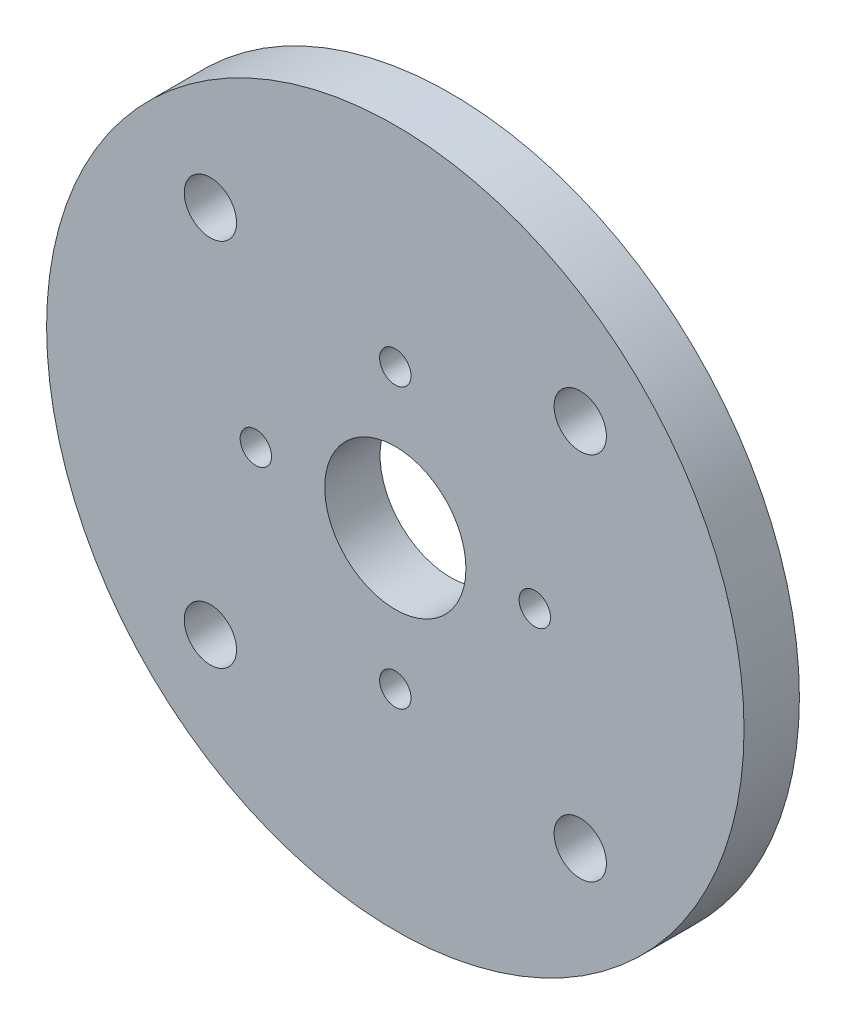
ISO-10303-21;
HEADER;
FILE_DESCRIPTION(('STEP AP214'),'2;1');
FILE_NAME('part.step','',(''),(''),'','','');
FILE_SCHEMA(('AUTOMOTIVE_DESIGN { 1 0 10303 214 1 1 1 1 }'));
ENDSEC;
DATA;
#1=APPLICATION_CONTEXT('core data for automotive mechanical design processes');
#2=APPLICATION_PROTOCOL_DEFINITION('international standard','automotive_design',2000,#1);
#3=PRODUCT_CONTEXT('',#1,'mechanical');
#4=PRODUCT('Part','Part','',(#3));
#5=PRODUCT_RELATED_PRODUCT_CATEGORY('part','',(#4));
#6=PRODUCT_DEFINITION_FORMATION('','',#4);
#7=PRODUCT_DEFINITION_CONTEXT('part definition',#1,'design');
#8=PRODUCT_DEFINITION('design','',#6,#7);
#9=PRODUCT_DEFINITION_SHAPE('','',#8);
#10=(LENGTH_UNIT() NAMED_UNIT(*) SI_UNIT(.MILLI.,.METRE.));
#11=(NAMED_UNIT(*) PLANE_ANGLE_UNIT() SI_UNIT($,.RADIAN.));
#12=(NAMED_UNIT(*) SI_UNIT($,.STERADIAN.) SOLID_ANGLE_UNIT());
#13=UNCERTAINTY_MEASURE_WITH_UNIT(LENGTH_MEASURE(1.E-05),#10,'distance_accuracy_value','');
#14=(GEOMETRIC_REPRESENTATION_CONTEXT(3) GLOBAL_UNCERTAINTY_ASSIGNED_CONTEXT((#13)) GLOBAL_UNIT_ASSIGNED_CONTEXT((#10,
#11,#12)) REPRESENTATION_CONTEXT('',''));
#15=CARTESIAN_POINT('',(0.,0.,0.));
#16=DIRECTION('',(0.,0.,1.));
#17=DIRECTION('',(1.,0.,0.));
#18=AXIS2_PLACEMENT_3D('',#15,#16,#17);
#19=CARTESIAN_POINT('',(0.,0.,3.175));
#20=DIRECTION('',(0.,0.,-1.));
#21=DIRECTION('',(-1.,0.,0.));
#22=AXIS2_PLACEMENT_3D('',#19,#20,#21);
#23=CYLINDRICAL_SURFACE('',#22,20.);
#24=CARTESIAN_POINT('',(0.,0.,3.175));
#25=DIRECTION('',(0.,0.,1.));
#26=DIRECTION('',(1.,0.,0.));
#27=AXIS2_PLACEMENT_3D('',#24,#25,#26);
#28=CIRCLE('',#27,20.);
#29=CARTESIAN_POINT('',(20.,0.,3.175));
#30=VERTEX_POINT('',#29);
#31=EDGE_CURVE('E10',#30,#30,#28,.T.);
#32=ORIENTED_EDGE('',*,*,#31,.F.);
#33=EDGE_LOOP('',(#32));
#34=FACE_BOUND('',#33,.T.);
#35=CARTESIAN_POINT('',(0.,0.,0.));
#36=DIRECTION('',(0.,0.,1.));
#37=DIRECTION('',(1.,0.,0.));
#38=AXIS2_PLACEMENT_3D('',#35,#36,#37);
#39=CIRCLE('',#38,20.);
#40=CARTESIAN_POINT('',(20.,0.,0.));
#41=VERTEX_POINT('',#40);
#42=EDGE_CURVE('E39',#41,#41,#39,.T.);
#43=ORIENTED_EDGE('',*,*,#42,.T.);
#44=EDGE_LOOP('',(#43));
#45=FACE_BOUND('',#44,.T.);
#46=ADVANCED_FACE('F36',(#34,#45),#23,.T.);
#47=CARTESIAN_POINT('',(0.,0.,3.175));
#48=DIRECTION('',(0.,0.,1.));
#49=DIRECTION('',(1.,0.,0.));
#50=AXIS2_PLACEMENT_3D('',#47,#48,#49);
#51=PLANE('',#50);
#52=CARTESIAN_POINT('',(-10.6066017177982,10.6066017177982,3.175));
#53=DIRECTION('',(0.,0.,1.));
#54=DIRECTION('',(1.,0.,0.));
#55=AXIS2_PLACEMENT_3D('',#52,#53,#54);
#56=CIRCLE('',#55,1.5);
#57=CARTESIAN_POINT('',(-9.10660171779824,10.6066017177982,3.175));
#58=VERTEX_POINT('',#57);
#59=EDGE_CURVE('E70',#58,#58,#56,.T.);
#60=ORIENTED_EDGE('',*,*,#59,.F.);
#61=EDGE_LOOP('',(#60));
#62=FACE_BOUND('',#61,.T.);
#63=CARTESIAN_POINT('',(-10.6066017177982,-10.6066017177982,3.175));
#64=DIRECTION('',(0.,0.,1.));
#65=DIRECTION('',(1.,0.,0.));
#66=AXIS2_PLACEMENT_3D('',#63,#64,#65);
#67=CIRCLE('',#66,1.5);
#68=CARTESIAN_POINT('',(-9.10660171779819,-10.6066017177982,3.175));
#69=VERTEX_POINT('',#68);
#70=EDGE_CURVE('E80',#69,#69,#67,.T.);
#71=ORIENTED_EDGE('',*,*,#70,.F.);
#72=EDGE_LOOP('',(#71));
#73=FACE_BOUND('',#72,.T.);
#74=CARTESIAN_POINT('',(10.6066017177982,-10.6066017177982,3.175));
#75=DIRECTION('',(0.,0.,1.));
#76=DIRECTION('',(1.,0.,0.));
#77=AXIS2_PLACEMENT_3D('',#74,#75,#76);
#78=CIRCLE('',#77,1.5);
#79=CARTESIAN_POINT('',(12.1066017177982,-10.6066017177982,3.175));
#80=VERTEX_POINT('',#79);
#81=EDGE_CURVE('E83',#80,#80,#78,.T.);
#82=ORIENTED_EDGE('',*,*,#81,.F.);
#83=EDGE_LOOP('',(#82));
#84=FACE_BOUND('',#83,.T.);
#85=CARTESIAN_POINT('',(10.6066017177982,10.6066017177982,3.175));
#86=DIRECTION('',(0.,0.,1.));
#87=DIRECTION('',(1.,0.,0.));
#88=AXIS2_PLACEMENT_3D('',#85,#86,#87);
#89=CIRCLE('',#88,1.5);
#90=CARTESIAN_POINT('',(12.1066017177982,10.6066017177982,3.175));
#91=VERTEX_POINT('',#90);
#92=EDGE_CURVE('E86',#91,#91,#89,.T.);
#93=ORIENTED_EDGE('',*,*,#92,.F.);
#94=EDGE_LOOP('',(#93));
#95=FACE_BOUND('',#94,.T.);
#96=CARTESIAN_POINT('',(0.,8.,3.175));
#97=DIRECTION('',(0.,0.,1.));
#98=DIRECTION('',(1.,0.,0.));
#99=AXIS2_PLACEMENT_3D('',#96,#97,#98);
#100=CIRCLE('',#99,0.9);
#101=CARTESIAN_POINT('',(0.9,8.,3.175));
#102=VERTEX_POINT('',#101);
#103=EDGE_CURVE('E61',#102,#102,#100,.T.);
#104=ORIENTED_EDGE('',*,*,#103,.F.);
#105=EDGE_LOOP('',(#104));
#106=FACE_BOUND('',#105,.T.);
#107=CARTESIAN_POINT('',(8.,0.,3.175));
#108=DIRECTION('',(0.,0.,1.));
#109=DIRECTION('',(1.,0.,0.));
#110=AXIS2_PLACEMENT_3D('',#107,#108,#109);
#111=CIRCLE('',#110,0.9);
#112=CARTESIAN_POINT('',(8.9,0.,3.175));
#113=VERTEX_POINT('',#112);
#114=EDGE_CURVE('E54',#113,#113,#111,.T.);
#115=ORIENTED_EDGE('',*,*,#114,.F.);
#116=EDGE_LOOP('',(#115));
#117=FACE_BOUND('',#116,.T.);
#118=CARTESIAN_POINT('',(0.,-8.,3.175));
#119=DIRECTION('',(0.,0.,1.));
#120=DIRECTION('',(1.,0.,0.));
#121=AXIS2_PLACEMENT_3D('',#118,#119,#120);
#122=CIRCLE('',#121,0.9);
#123=CARTESIAN_POINT('',(0.899999999999998,-8.,3.175));
#124=VERTEX_POINT('',#123);
#125=EDGE_CURVE('E73',#124,#124,#122,.T.);
#126=ORIENTED_EDGE('',*,*,#125,.F.);
#127=EDGE_LOOP('',(#126));
#128=FACE_BOUND('',#127,.T.);
#129=CARTESIAN_POINT('',(-8.,0.,3.175));
#130=DIRECTION('',(0.,0.,1.));
#131=DIRECTION('',(1.,0.,0.));
#132=AXIS2_PLACEMENT_3D('',#129,#130,#131);
#133=CIRCLE('',#132,0.899999999999999);
#134=CARTESIAN_POINT('',(-7.1,0.,3.175));
#135=VERTEX_POINT('',#134);
#136=EDGE_CURVE('E66',#135,#135,#133,.T.);
#137=ORIENTED_EDGE('',*,*,#136,.F.);
#138=EDGE_LOOP('',(#137));
#139=FACE_BOUND('',#138,.T.);
#140=CARTESIAN_POINT('',(0.,0.,3.175));
#141=DIRECTION('',(0.,0.,1.));
#142=DIRECTION('',(1.,0.,0.));
#143=AXIS2_PLACEMENT_3D('',#140,#141,#142);
#144=CIRCLE('',#143,4.05);
#145=CARTESIAN_POINT('',(4.05,0.,3.175));
#146=VERTEX_POINT('',#145);
#147=EDGE_CURVE('E48',#146,#146,#144,.T.);
#148=ORIENTED_EDGE('',*,*,#147,.F.);
#149=EDGE_LOOP('',(#148));
#150=FACE_BOUND('',#149,.T.);
#151=ORIENTED_EDGE('',*,*,#31,.T.);
#152=EDGE_LOOP('',(#151));
#153=FACE_BOUND('',#152,.T.);
#154=ADVANCED_FACE('F122',(#62,#73,#84,#95,#106,#117,#128,#139,#150,#153),#51,.T.);
#155=CARTESIAN_POINT('',(0.,0.,0.));
#156=DIRECTION('',(0.,0.,1.));
#157=DIRECTION('',(1.,0.,0.));
#158=AXIS2_PLACEMENT_3D('',#155,#156,#157);
#159=PLANE('',#158);
#160=CARTESIAN_POINT('',(-10.6066017177982,10.6066017177982,0.));
#161=DIRECTION('',(0.,0.,1.));
#162=DIRECTION('',(1.,0.,0.));
#163=AXIS2_PLACEMENT_3D('',#160,#161,#162);
#164=CIRCLE('',#163,1.5);
#165=CARTESIAN_POINT('',(-9.10660171779824,10.6066017177982,0.));
#166=VERTEX_POINT('',#165);
#167=EDGE_CURVE('E93',#166,#166,#164,.T.);
#168=ORIENTED_EDGE('',*,*,#167,.T.);
#169=EDGE_LOOP('',(#168));
#170=FACE_BOUND('',#169,.T.);
#171=CARTESIAN_POINT('',(-10.6066017177982,-10.6066017177982,0.));
#172=DIRECTION('',(0.,0.,1.));
#173=DIRECTION('',(1.,0.,0.));
#174=AXIS2_PLACEMENT_3D('',#171,#172,#173);
#175=CIRCLE('',#174,1.5);
#176=CARTESIAN_POINT('',(-9.10660171779819,-10.6066017177982,0.));
#177=VERTEX_POINT('',#176);
#178=EDGE_CURVE('E96',#177,#177,#175,.T.);
#179=ORIENTED_EDGE('',*,*,#178,.T.);
#180=EDGE_LOOP('',(#179));
#181=FACE_BOUND('',#180,.T.);
#182=CARTESIAN_POINT('',(10.6066017177982,-10.6066017177982,0.));
#183=DIRECTION('',(0.,0.,1.));
#184=DIRECTION('',(1.,0.,0.));
#185=AXIS2_PLACEMENT_3D('',#182,#183,#184);
#186=CIRCLE('',#185,1.5);
#187=CARTESIAN_POINT('',(12.1066017177982,-10.6066017177982,0.));
#188=VERTEX_POINT('',#187);
#189=EDGE_CURVE('E92',#188,#188,#186,.T.);
#190=ORIENTED_EDGE('',*,*,#189,.T.);
#191=EDGE_LOOP('',(#190));
#192=FACE_BOUND('',#191,.T.);
#193=CARTESIAN_POINT('',(10.6066017177982,10.6066017177982,0.));
#194=DIRECTION('',(0.,0.,1.));
#195=DIRECTION('',(1.,0.,0.));
#196=AXIS2_PLACEMENT_3D('',#193,#194,#195);
#197=CIRCLE('',#196,1.5);
#198=CARTESIAN_POINT('',(12.1066017177982,10.6066017177982,0.));
#199=VERTEX_POINT('',#198);
#200=EDGE_CURVE('E89',#199,#199,#197,.T.);
#201=ORIENTED_EDGE('',*,*,#200,.T.);
#202=EDGE_LOOP('',(#201));
#203=FACE_BOUND('',#202,.T.);
#204=CARTESIAN_POINT('',(0.,8.,0.));
#205=DIRECTION('',(0.,0.,1.));
#206=DIRECTION('',(1.,0.,0.));
#207=AXIS2_PLACEMENT_3D('',#204,#205,#206);
#208=CIRCLE('',#207,0.9);
#209=CARTESIAN_POINT('',(0.9,8.,0.));
#210=VERTEX_POINT('',#209);
#211=EDGE_CURVE('E51',#210,#210,#208,.T.);
#212=ORIENTED_EDGE('',*,*,#211,.T.);
#213=EDGE_LOOP('',(#212));
#214=FACE_BOUND('',#213,.T.);
#215=CARTESIAN_POINT('',(8.,0.,0.));
#216=DIRECTION('',(0.,0.,1.));
#217=DIRECTION('',(1.,0.,0.));
#218=AXIS2_PLACEMENT_3D('',#215,#216,#217);
#219=CIRCLE('',#218,0.9);
#220=CARTESIAN_POINT('',(8.9,0.,0.));
#221=VERTEX_POINT('',#220);
#222=EDGE_CURVE('E57',#221,#221,#219,.T.);
#223=ORIENTED_EDGE('',*,*,#222,.T.);
#224=EDGE_LOOP('',(#223));
#225=FACE_BOUND('',#224,.T.);
#226=CARTESIAN_POINT('',(0.,-8.,0.));
#227=DIRECTION('',(0.,0.,1.));
#228=DIRECTION('',(1.,0.,0.));
#229=AXIS2_PLACEMENT_3D('',#226,#227,#228);
#230=CIRCLE('',#229,0.9);
#231=CARTESIAN_POINT('',(0.899999999999998,-8.,0.));
#232=VERTEX_POINT('',#231);
#233=EDGE_CURVE('E58',#232,#232,#230,.T.);
#234=ORIENTED_EDGE('',*,*,#233,.T.);
#235=EDGE_LOOP('',(#234));
#236=FACE_BOUND('',#235,.T.);
#237=CARTESIAN_POINT('',(-8.,0.,0.));
#238=DIRECTION('',(0.,0.,1.));
#239=DIRECTION('',(1.,0.,0.));
#240=AXIS2_PLACEMENT_3D('',#237,#238,#239);
#241=CIRCLE('',#240,0.899999999999999);
#242=CARTESIAN_POINT('',(-7.1,0.,0.));
#243=VERTEX_POINT('',#242);
#244=EDGE_CURVE('E69',#243,#243,#241,.T.);
#245=ORIENTED_EDGE('',*,*,#244,.T.);
#246=EDGE_LOOP('',(#245));
#247=FACE_BOUND('',#246,.T.);
#248=CARTESIAN_POINT('',(0.,0.,0.));
#249=DIRECTION('',(0.,0.,1.));
#250=DIRECTION('',(1.,0.,0.));
#251=AXIS2_PLACEMENT_3D('',#248,#249,#250);
#252=CIRCLE('',#251,4.05);
#253=CARTESIAN_POINT('',(4.05,0.,0.));
#254=VERTEX_POINT('',#253);
#255=EDGE_CURVE('E46',#254,#254,#252,.T.);
#256=ORIENTED_EDGE('',*,*,#255,.T.);
#257=EDGE_LOOP('',(#256));
#258=FACE_BOUND('',#257,.T.);
#259=ORIENTED_EDGE('',*,*,#42,.F.);
#260=EDGE_LOOP('',(#259));
#261=FACE_BOUND('',#260,.T.);
#262=ADVANCED_FACE('F102',(#170,#181,#192,#203,#214,#225,#236,#247,#258,#261),#159,.F.);
#263=CARTESIAN_POINT('',(0.,0.,0.));
#264=DIRECTION('',(0.,0.,1.));
#265=DIRECTION('',(1.,0.,0.));
#266=AXIS2_PLACEMENT_3D('',#263,#264,#265);
#267=CYLINDRICAL_SURFACE('',#266,4.05);
#268=ORIENTED_EDGE('',*,*,#255,.F.);
#269=EDGE_LOOP('',(#268));
#270=FACE_BOUND('',#269,.T.);
#271=ORIENTED_EDGE('',*,*,#147,.T.);
#272=EDGE_LOOP('',(#271));
#273=FACE_BOUND('',#272,.T.);
#274=ADVANCED_FACE('F133',(#270,#273),#267,.F.);
#275=CARTESIAN_POINT('',(-8.,0.,0.));
#276=DIRECTION('',(0.,0.,1.));
#277=DIRECTION('',(1.,0.,0.));
#278=AXIS2_PLACEMENT_3D('',#275,#276,#277);
#279=CYLINDRICAL_SURFACE('',#278,0.899999999999999);
#280=ORIENTED_EDGE('',*,*,#244,.F.);
#281=EDGE_LOOP('',(#280));
#282=FACE_BOUND('',#281,.T.);
#283=ORIENTED_EDGE('',*,*,#136,.T.);
#284=EDGE_LOOP('',(#283));
#285=FACE_BOUND('',#284,.T.);
#286=ADVANCED_FACE('F138',(#282,#285),#279,.F.);
#287=CARTESIAN_POINT('',(0.,-8.,0.));
#288=DIRECTION('',(0.,0.,1.));
#289=DIRECTION('',(1.,0.,0.));
#290=AXIS2_PLACEMENT_3D('',#287,#288,#289);
#291=CYLINDRICAL_SURFACE('',#290,0.9);
#292=ORIENTED_EDGE('',*,*,#233,.F.);
#293=EDGE_LOOP('',(#292));
#294=FACE_BOUND('',#293,.T.);
#295=ORIENTED_EDGE('',*,*,#125,.T.);
#296=EDGE_LOOP('',(#295));
#297=FACE_BOUND('',#296,.T.);
#298=ADVANCED_FACE('F146',(#294,#297),#291,.F.);
#299=CARTESIAN_POINT('',(8.,0.,0.));
#300=DIRECTION('',(0.,0.,1.));
#301=DIRECTION('',(1.,0.,0.));
#302=AXIS2_PLACEMENT_3D('',#299,#300,#301);
#303=CYLINDRICAL_SURFACE('',#302,0.9);
#304=ORIENTED_EDGE('',*,*,#222,.F.);
#305=EDGE_LOOP('',(#304));
#306=FACE_BOUND('',#305,.T.);
#307=ORIENTED_EDGE('',*,*,#114,.T.);
#308=EDGE_LOOP('',(#307));
#309=FACE_BOUND('',#308,.T.);
#310=ADVANCED_FACE('F143',(#306,#309),#303,.F.);
#311=CARTESIAN_POINT('',(0.,8.,0.));
#312=DIRECTION('',(0.,0.,1.));
#313=DIRECTION('',(1.,0.,0.));
#314=AXIS2_PLACEMENT_3D('',#311,#312,#313);
#315=CYLINDRICAL_SURFACE('',#314,0.9);
#316=ORIENTED_EDGE('',*,*,#211,.F.);
#317=EDGE_LOOP('',(#316));
#318=FACE_BOUND('',#317,.T.);
#319=ORIENTED_EDGE('',*,*,#103,.T.);
#320=EDGE_LOOP('',(#319));
#321=FACE_BOUND('',#320,.T.);
#322=ADVANCED_FACE('F118',(#318,#321),#315,.F.);
#323=CARTESIAN_POINT('',(10.6066017177982,10.6066017177982,0.));
#324=DIRECTION('',(0.,0.,1.));
#325=DIRECTION('',(1.,0.,0.));
#326=AXIS2_PLACEMENT_3D('',#323,#324,#325);
#327=CYLINDRICAL_SURFACE('',#326,1.5);
#328=ORIENTED_EDGE('',*,*,#92,.T.);
#329=EDGE_LOOP('',(#328));
#330=FACE_BOUND('',#329,.T.);
#331=ORIENTED_EDGE('',*,*,#200,.F.);
#332=EDGE_LOOP('',(#331));
#333=FACE_BOUND('',#332,.T.);
#334=ADVANCED_FACE('F108',(#330,#333),#327,.F.);
#335=CARTESIAN_POINT('',(10.6066017177982,-10.6066017177982,0.));
#336=DIRECTION('',(0.,0.,1.));
#337=DIRECTION('',(1.,0.,0.));
#338=AXIS2_PLACEMENT_3D('',#335,#336,#337);
#339=CYLINDRICAL_SURFACE('',#338,1.5);
#340=ORIENTED_EDGE('',*,*,#81,.T.);
#341=EDGE_LOOP('',(#340));
#342=FACE_BOUND('',#341,.T.);
#343=ORIENTED_EDGE('',*,*,#189,.F.);
#344=EDGE_LOOP('',(#343));
#345=FACE_BOUND('',#344,.T.);
#346=ADVANCED_FACE('F105',(#342,#345),#339,.F.);
#347=CARTESIAN_POINT('',(-10.6066017177982,-10.6066017177982,0.));
#348=DIRECTION('',(0.,0.,1.));
#349=DIRECTION('',(1.,0.,0.));
#350=AXIS2_PLACEMENT_3D('',#347,#348,#349);
#351=CYLINDRICAL_SURFACE('',#350,1.5);
#352=ORIENTED_EDGE('',*,*,#70,.T.);
#353=EDGE_LOOP('',(#352));
#354=FACE_BOUND('',#353,.T.);
#355=ORIENTED_EDGE('',*,*,#178,.F.);
#356=EDGE_LOOP('',(#355));
#357=FACE_BOUND('',#356,.T.);
#358=ADVANCED_FACE('F107',(#354,#357),#351,.F.);
#359=CARTESIAN_POINT('',(-10.6066017177982,10.6066017177982,0.));
#360=DIRECTION('',(0.,0.,1.));
#361=DIRECTION('',(1.,0.,0.));
#362=AXIS2_PLACEMENT_3D('',#359,#360,#361);
#363=CYLINDRICAL_SURFACE('',#362,1.5);
#364=ORIENTED_EDGE('',*,*,#59,.T.);
#365=EDGE_LOOP('',(#364));
#366=FACE_BOUND('',#365,.T.);
#367=ORIENTED_EDGE('',*,*,#167,.F.);
#368=EDGE_LOOP('',(#367));
#369=FACE_BOUND('',#368,.T.);
#370=ADVANCED_FACE('F115',(#366,#369),#363,.F.);
#371=CLOSED_SHELL('',(#46,#154,#262,#274,#286,#298,#310,#322,#334,#346,#358,#370));
#372=MANIFOLD_SOLID_BREP('B2',#371);
#373=ADVANCED_BREP_SHAPE_REPRESENTATION('',(#18,#372),#14);
#374=SHAPE_DEFINITION_REPRESENTATION(#9,#373);
ENDSEC;
END-ISO-10303-21;
